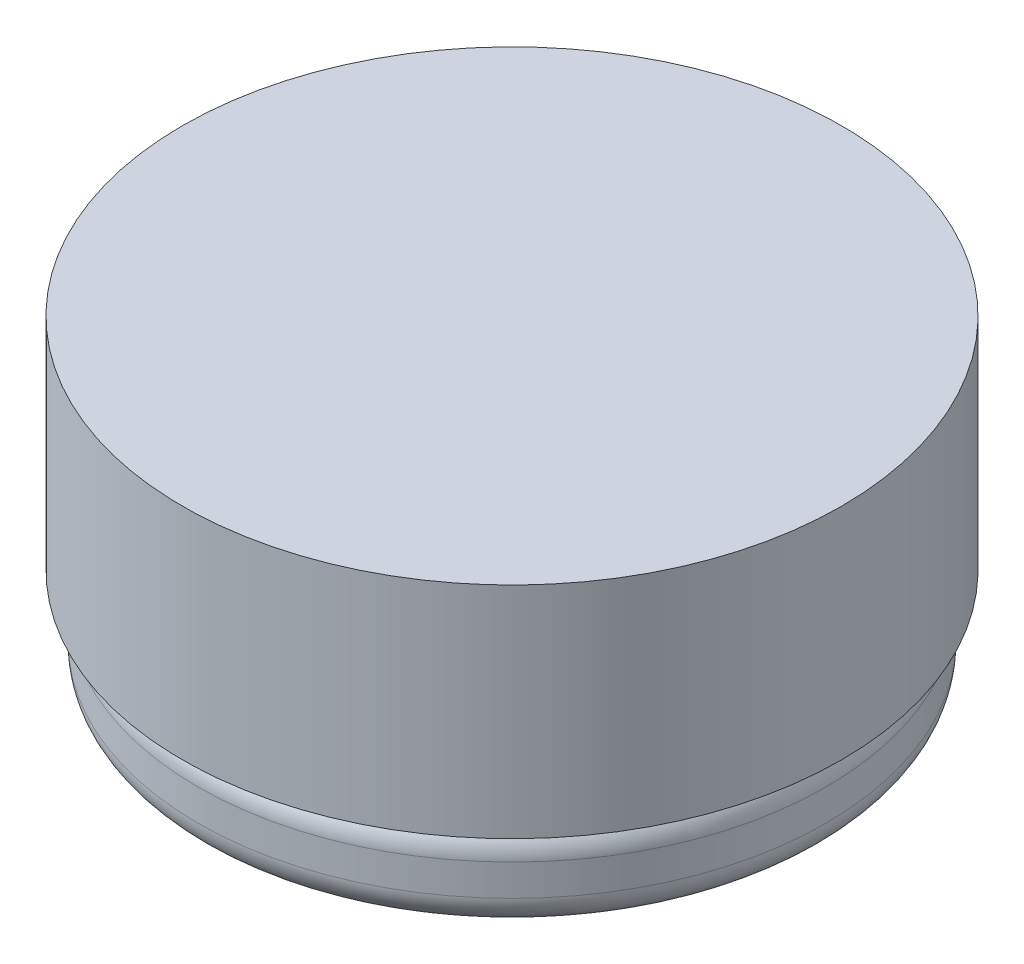
ISO-10303-21;
HEADER;
FILE_DESCRIPTION(('STEP AP214'),'2;1');
FILE_NAME('part.step','',(''),(''),'','','');
FILE_SCHEMA(('AUTOMOTIVE_DESIGN { 1 0 10303 214 1 1 1 1 }'));
ENDSEC;
DATA;
#1=APPLICATION_CONTEXT('core data for automotive mechanical design processes');
#2=APPLICATION_PROTOCOL_DEFINITION('international standard','automotive_design',2000,#1);
#3=PRODUCT_CONTEXT('',#1,'mechanical');
#4=PRODUCT('Part','Part','',(#3));
#5=PRODUCT_RELATED_PRODUCT_CATEGORY('part','',(#4));
#6=PRODUCT_DEFINITION_FORMATION('','',#4);
#7=PRODUCT_DEFINITION_CONTEXT('part definition',#1,'design');
#8=PRODUCT_DEFINITION('design','',#6,#7);
#9=PRODUCT_DEFINITION_SHAPE('','',#8);
#10=(LENGTH_UNIT() NAMED_UNIT(*) SI_UNIT(.MILLI.,.METRE.));
#11=(NAMED_UNIT(*) PLANE_ANGLE_UNIT() SI_UNIT($,.RADIAN.));
#12=(NAMED_UNIT(*) SI_UNIT($,.STERADIAN.) SOLID_ANGLE_UNIT());
#13=UNCERTAINTY_MEASURE_WITH_UNIT(LENGTH_MEASURE(1.E-05),#10,'distance_accuracy_value','');
#14=(GEOMETRIC_REPRESENTATION_CONTEXT(3) GLOBAL_UNCERTAINTY_ASSIGNED_CONTEXT((#13)) GLOBAL_UNIT_ASSIGNED_CONTEXT((#10,
#11,#12)) REPRESENTATION_CONTEXT('',''));
#15=CARTESIAN_POINT('',(0.,0.,0.));
#16=DIRECTION('',(0.,0.,1.));
#17=DIRECTION('',(1.,0.,0.));
#18=AXIS2_PLACEMENT_3D('',#15,#16,#17);
#19=CARTESIAN_POINT('',(-2.,-5.,0.4));
#20=DIRECTION('',(0.,0.,1.));
#21=DIRECTION('',(1.,0.,0.));
#22=AXIS2_PLACEMENT_3D('',#19,#20,#21);
#23=PLANE('',#22);
#24=DIRECTION('',(0.,-1.,0.));
#25=VECTOR('',#24,1.);
#26=CARTESIAN_POINT('',(0.4,-5.,0.4));
#27=LINE('',#26,#25);
#28=CARTESIAN_POINT('',(0.4,-3.6,0.4));
#29=VERTEX_POINT('',#28);
#30=CARTESIAN_POINT('',(0.4,-5.,0.4));
#31=VERTEX_POINT('',#30);
#32=EDGE_CURVE('P0_E40',#29,#31,#27,.T.);
#33=ORIENTED_EDGE('',*,*,#32,.F.);
#34=DIRECTION('',(1.,0.,0.));
#35=VECTOR('',#34,1.);
#36=CARTESIAN_POINT('',(-2.,-3.6,0.4));
#37=LINE('',#36,#35);
#38=CARTESIAN_POINT('',(0.6,-3.6,0.4));
#39=VERTEX_POINT('',#38);
#40=EDGE_CURVE('P0_E11',#29,#39,#37,.T.);
#41=ORIENTED_EDGE('',*,*,#40,.T.);
#42=DIRECTION('',(0.707106781186547,-0.707106781186548,0.));
#43=VECTOR('',#42,1.);
#44=CARTESIAN_POINT('',(0.65,-3.65,0.4));
#45=LINE('',#44,#43);
#46=CARTESIAN_POINT('',(2.,-5.,0.4));
#47=VERTEX_POINT('',#46);
#48=EDGE_CURVE('P0_E27',#39,#47,#45,.T.);
#49=ORIENTED_EDGE('',*,*,#48,.T.);
#50=DIRECTION('',(1.,0.,0.));
#51=VECTOR('',#50,1.);
#52=CARTESIAN_POINT('',(-1.,-5.,0.4));
#53=LINE('',#52,#51);
#54=EDGE_CURVE('P0_E217',#31,#47,#53,.T.);
#55=ORIENTED_EDGE('',*,*,#54,.F.);
#56=EDGE_LOOP('',(#33,#41,#49,#55));
#57=FACE_BOUND('',#56,.T.);
#58=ADVANCED_FACE('P0_F16',(#57),#23,.F.);
#59=CARTESIAN_POINT('',(2.,-5.,-0.4));
#60=DIRECTION('',(0.,0.,-1.));
#61=DIRECTION('',(0.,-1.,0.));
#62=AXIS2_PLACEMENT_3D('',#59,#60,#61);
#63=PLANE('',#62);
#64=DIRECTION('',(0.,1.,0.));
#65=VECTOR('',#64,1.);
#66=CARTESIAN_POINT('',(0.4,-5.,-0.4));
#67=LINE('',#66,#65);
#68=CARTESIAN_POINT('',(0.4,-5.,-0.4));
#69=VERTEX_POINT('',#68);
#70=CARTESIAN_POINT('',(0.4,-3.6,-0.4));
#71=VERTEX_POINT('',#70);
#72=EDGE_CURVE('P0_E225',#69,#71,#67,.T.);
#73=ORIENTED_EDGE('',*,*,#72,.F.);
#74=DIRECTION('',(-1.,0.,0.));
#75=VECTOR('',#74,1.);
#76=CARTESIAN_POINT('',(1.,-5.,-0.4));
#77=LINE('',#76,#75);
#78=CARTESIAN_POINT('',(2.,-5.,-0.4));
#79=VERTEX_POINT('',#78);
#80=EDGE_CURVE('P0_E231',#79,#69,#77,.T.);
#81=ORIENTED_EDGE('',*,*,#80,.F.);
#82=DIRECTION('',(-0.707106781186547,0.707106781186548,0.));
#83=VECTOR('',#82,1.);
#84=CARTESIAN_POINT('',(1.65,-4.65,-0.4));
#85=LINE('',#84,#83);
#86=CARTESIAN_POINT('',(0.6,-3.6,-0.4));
#87=VERTEX_POINT('',#86);
#88=EDGE_CURVE('P0_E275',#79,#87,#85,.T.);
#89=ORIENTED_EDGE('',*,*,#88,.T.);
#90=DIRECTION('',(-1.,0.,0.));
#91=VECTOR('',#90,1.);
#92=CARTESIAN_POINT('',(2.,-3.6,-0.4));
#93=LINE('',#92,#91);
#94=EDGE_CURVE('P0_E187',#87,#71,#93,.T.);
#95=ORIENTED_EDGE('',*,*,#94,.T.);
#96=EDGE_LOOP('',(#73,#81,#89,#95));
#97=FACE_BOUND('',#96,.T.);
#98=ADVANCED_FACE('P0_F18',(#97),#63,.F.);
#99=CARTESIAN_POINT('',(-1.3,-4.3,-0.2));
#100=DIRECTION('',(-0.707106781186548,0.707106781186547,0.));
#101=DIRECTION('',(0.,0.,1.));
#102=AXIS2_PLACEMENT_3D('',#99,#100,#101);
#103=PLANE('',#102);
#104=DIRECTION('',(0.707106781186547,0.707106781186548,0.));
#105=VECTOR('',#104,1.);
#106=CARTESIAN_POINT('',(-1.65,-4.65,0.4));
#107=LINE('',#106,#105);
#108=CARTESIAN_POINT('',(-2.,-5.,0.4));
#109=VERTEX_POINT('',#108);
#110=CARTESIAN_POINT('',(-0.6,-3.6,0.4));
#111=VERTEX_POINT('',#110);
#112=EDGE_CURVE('P0_E206',#109,#111,#107,.T.);
#113=ORIENTED_EDGE('',*,*,#112,.F.);
#114=DIRECTION('',(0.,0.,1.));
#115=VECTOR('',#114,1.);
#116=CARTESIAN_POINT('',(-2.,-5.,-0.1));
#117=LINE('',#116,#115);
#118=CARTESIAN_POINT('',(-2.,-5.,-0.4));
#119=VERTEX_POINT('',#118);
#120=EDGE_CURVE('P0_E144',#119,#109,#117,.T.);
#121=ORIENTED_EDGE('',*,*,#120,.F.);
#122=DIRECTION('',(-0.707106781186547,-0.707106781186548,0.));
#123=VECTOR('',#122,1.);
#124=CARTESIAN_POINT('',(-0.65,-3.65,-0.4));
#125=LINE('',#124,#123);
#126=CARTESIAN_POINT('',(-0.6,-3.6,-0.4));
#127=VERTEX_POINT('',#126);
#128=EDGE_CURVE('P0_E210',#127,#119,#125,.T.);
#129=ORIENTED_EDGE('',*,*,#128,.F.);
#130=DIRECTION('',(0.,0.,-1.));
#131=VECTOR('',#130,1.);
#132=CARTESIAN_POINT('',(-0.6,-3.6,-0.2));
#133=LINE('',#132,#131);
#134=EDGE_CURVE('P0_E297',#111,#127,#133,.T.);
#135=ORIENTED_EDGE('',*,*,#134,.F.);
#136=EDGE_LOOP('',(#113,#121,#129,#135));
#137=FACE_BOUND('',#136,.T.);
#138=ADVANCED_FACE('P0_F317',(#137),#103,.F.);
#139=CARTESIAN_POINT('',(2.,-5.,-0.4));
#140=DIRECTION('',(0.,0.,-1.));
#141=DIRECTION('',(0.,-1.,0.));
#142=AXIS2_PLACEMENT_3D('',#139,#140,#141);
#143=PLANE('',#142);
#144=DIRECTION('',(0.,-1.,0.));
#145=VECTOR('',#144,1.);
#146=CARTESIAN_POINT('',(-0.4,-5.,-0.4));
#147=LINE('',#146,#145);
#148=CARTESIAN_POINT('',(-0.4,-3.6,-0.4));
#149=VERTEX_POINT('',#148);
#150=CARTESIAN_POINT('',(-0.4,-5.,-0.4));
#151=VERTEX_POINT('',#150);
#152=EDGE_CURVE('P0_E20',#149,#151,#147,.T.);
#153=ORIENTED_EDGE('',*,*,#152,.F.);
#154=DIRECTION('',(-1.,0.,0.));
#155=VECTOR('',#154,1.);
#156=CARTESIAN_POINT('',(2.,-3.6,-0.4));
#157=LINE('',#156,#155);
#158=EDGE_CURVE('P0_E269',#149,#127,#157,.T.);
#159=ORIENTED_EDGE('',*,*,#158,.T.);
#160=ORIENTED_EDGE('',*,*,#128,.T.);
#161=DIRECTION('',(-1.,0.,0.));
#162=VECTOR('',#161,1.);
#163=CARTESIAN_POINT('',(1.,-5.,-0.4));
#164=LINE('',#163,#162);
#165=EDGE_CURVE('P0_E71',#151,#119,#164,.T.);
#166=ORIENTED_EDGE('',*,*,#165,.F.);
#167=EDGE_LOOP('',(#153,#159,#160,#166));
#168=FACE_BOUND('',#167,.T.);
#169=ADVANCED_FACE('P0_F318',(#168),#143,.F.);
#170=CARTESIAN_POINT('',(1.3,-4.3,0.2));
#171=DIRECTION('',(0.707106781186548,0.707106781186547,0.));
#172=DIRECTION('',(0.,0.,-1.));
#173=AXIS2_PLACEMENT_3D('',#170,#171,#172);
#174=PLANE('',#173);
#175=ORIENTED_EDGE('',*,*,#88,.F.);
#176=DIRECTION('',(0.,0.,-1.));
#177=VECTOR('',#176,1.);
#178=CARTESIAN_POINT('',(2.,-5.,0.1));
#179=LINE('',#178,#177);
#180=EDGE_CURVE('P0_E263',#47,#79,#179,.T.);
#181=ORIENTED_EDGE('',*,*,#180,.F.);
#182=ORIENTED_EDGE('',*,*,#48,.F.);
#183=DIRECTION('',(0.,0.,1.));
#184=VECTOR('',#183,1.);
#185=CARTESIAN_POINT('',(0.6,-3.6,0.2));
#186=LINE('',#185,#184);
#187=EDGE_CURVE('P0_E244',#87,#39,#186,.T.);
#188=ORIENTED_EDGE('',*,*,#187,.F.);
#189=EDGE_LOOP('',(#175,#181,#182,#188));
#190=FACE_BOUND('',#189,.T.);
#191=ADVANCED_FACE('P0_F320',(#190),#174,.F.);
#192=CARTESIAN_POINT('',(-2.,-5.,0.4));
#193=DIRECTION('',(0.,0.,1.));
#194=DIRECTION('',(1.,0.,0.));
#195=AXIS2_PLACEMENT_3D('',#192,#193,#194);
#196=PLANE('',#195);
#197=DIRECTION('',(0.,1.,0.));
#198=VECTOR('',#197,1.);
#199=CARTESIAN_POINT('',(-0.4,-5.,0.4));
#200=LINE('',#199,#198);
#201=CARTESIAN_POINT('',(-0.4,-5.,0.4));
#202=VERTEX_POINT('',#201);
#203=CARTESIAN_POINT('',(-0.4,-3.6,0.4));
#204=VERTEX_POINT('',#203);
#205=EDGE_CURVE('P0_E83',#202,#204,#200,.T.);
#206=ORIENTED_EDGE('',*,*,#205,.F.);
#207=DIRECTION('',(1.,0.,0.));
#208=VECTOR('',#207,1.);
#209=CARTESIAN_POINT('',(-1.,-5.,0.4));
#210=LINE('',#209,#208);
#211=EDGE_CURVE('P0_E301',#109,#202,#210,.T.);
#212=ORIENTED_EDGE('',*,*,#211,.F.);
#213=ORIENTED_EDGE('',*,*,#112,.T.);
#214=DIRECTION('',(1.,0.,0.));
#215=VECTOR('',#214,1.);
#216=CARTESIAN_POINT('',(-2.,-3.6,0.4));
#217=LINE('',#216,#215);
#218=EDGE_CURVE('P0_E211',#111,#204,#217,.T.);
#219=ORIENTED_EDGE('',*,*,#218,.T.);
#220=EDGE_LOOP('',(#206,#212,#213,#219));
#221=FACE_BOUND('',#220,.T.);
#222=ADVANCED_FACE('P0_F327',(#221),#196,.F.);
#223=CARTESIAN_POINT('',(0.4,-5.,2.));
#224=DIRECTION('',(1.,0.,0.));
#225=DIRECTION('',(0.,0.,1.));
#226=AXIS2_PLACEMENT_3D('',#223,#224,#225);
#227=PLANE('',#226);
#228=ORIENTED_EDGE('',*,*,#72,.T.);
#229=DIRECTION('',(0.,0.,-1.));
#230=VECTOR('',#229,1.);
#231=CARTESIAN_POINT('',(0.4,-3.6,2.));
#232=LINE('',#231,#230);
#233=CARTESIAN_POINT('',(0.4,-3.6,-0.6));
#234=VERTEX_POINT('',#233);
#235=EDGE_CURVE('P0_E205',#71,#234,#232,.T.);
#236=ORIENTED_EDGE('',*,*,#235,.T.);
#237=DIRECTION('',(0.,-0.707106781186548,-0.707106781186547));
#238=VECTOR('',#237,1.);
#239=CARTESIAN_POINT('',(0.4,-3.65,-0.65));
#240=LINE('',#239,#238);
#241=CARTESIAN_POINT('',(0.4,-5.,-2.));
#242=VERTEX_POINT('',#241);
#243=EDGE_CURVE('P0_E190',#234,#242,#240,.T.);
#244=ORIENTED_EDGE('',*,*,#243,.T.);
#245=DIRECTION('',(0.,0.,-1.));
#246=VECTOR('',#245,1.);
#247=CARTESIAN_POINT('',(0.4,-5.,1.));
#248=LINE('',#247,#246);
#249=EDGE_CURVE('P0_E228',#69,#242,#248,.T.);
#250=ORIENTED_EDGE('',*,*,#249,.F.);
#251=EDGE_LOOP('',(#228,#236,#244,#250));
#252=FACE_BOUND('',#251,.T.);
#253=ADVANCED_FACE('P0_F355',(#252),#227,.F.);
#254=CARTESIAN_POINT('',(0.4,-5.,2.));
#255=DIRECTION('',(1.,0.,0.));
#256=DIRECTION('',(0.,0.,1.));
#257=AXIS2_PLACEMENT_3D('',#254,#255,#256);
#258=PLANE('',#257);
#259=ORIENTED_EDGE('',*,*,#32,.T.);
#260=DIRECTION('',(0.,0.,-1.));
#261=VECTOR('',#260,1.);
#262=CARTESIAN_POINT('',(0.4,-5.,1.));
#263=LINE('',#262,#261);
#264=CARTESIAN_POINT('',(0.4,-5.,2.));
#265=VERTEX_POINT('',#264);
#266=EDGE_CURVE('P0_E196',#265,#31,#263,.T.);
#267=ORIENTED_EDGE('',*,*,#266,.F.);
#268=DIRECTION('',(0.,0.707106781186548,-0.707106781186547));
#269=VECTOR('',#268,1.);
#270=CARTESIAN_POINT('',(0.4,-4.65,1.65));
#271=LINE('',#270,#269);
#272=CARTESIAN_POINT('',(0.4,-3.6,0.6));
#273=VERTEX_POINT('',#272);
#274=EDGE_CURVE('P0_E191',#265,#273,#271,.T.);
#275=ORIENTED_EDGE('',*,*,#274,.T.);
#276=DIRECTION('',(0.,0.,-1.));
#277=VECTOR('',#276,1.);
#278=CARTESIAN_POINT('',(0.4,-3.6,2.));
#279=LINE('',#278,#277);
#280=EDGE_CURVE('P0_E192',#273,#29,#279,.T.);
#281=ORIENTED_EDGE('',*,*,#280,.T.);
#282=EDGE_LOOP('',(#259,#267,#275,#281));
#283=FACE_BOUND('',#282,.T.);
#284=ADVANCED_FACE('P0_F359',(#283),#258,.F.);
#285=CARTESIAN_POINT('',(-0.4,-5.,-2.));
#286=DIRECTION('',(-1.,0.,0.));
#287=DIRECTION('',(0.,0.,1.));
#288=AXIS2_PLACEMENT_3D('',#285,#286,#287);
#289=PLANE('',#288);
#290=ORIENTED_EDGE('',*,*,#152,.T.);
#291=DIRECTION('',(0.,0.,1.));
#292=VECTOR('',#291,1.);
#293=CARTESIAN_POINT('',(-0.4,-5.,-1.));
#294=LINE('',#293,#292);
#295=CARTESIAN_POINT('',(-0.4,-5.,-2.));
#296=VERTEX_POINT('',#295);
#297=EDGE_CURVE('P0_E260',#296,#151,#294,.T.);
#298=ORIENTED_EDGE('',*,*,#297,.F.);
#299=DIRECTION('',(0.,0.707106781186548,0.707106781186547));
#300=VECTOR('',#299,1.);
#301=CARTESIAN_POINT('',(-0.4,-4.65,-1.65));
#302=LINE('',#301,#300);
#303=CARTESIAN_POINT('',(-0.4,-3.6,-0.6));
#304=VERTEX_POINT('',#303);
#305=EDGE_CURVE('P0_E216',#296,#304,#302,.T.);
#306=ORIENTED_EDGE('',*,*,#305,.T.);
#307=DIRECTION('',(0.,0.,1.));
#308=VECTOR('',#307,1.);
#309=CARTESIAN_POINT('',(-0.4,-3.6,-2.));
#310=LINE('',#309,#308);
#311=EDGE_CURVE('P0_E212',#304,#149,#310,.T.);
#312=ORIENTED_EDGE('',*,*,#311,.T.);
#313=EDGE_LOOP('',(#290,#298,#306,#312));
#314=FACE_BOUND('',#313,.T.);
#315=ADVANCED_FACE('P0_F356',(#314),#289,.F.);
#316=CARTESIAN_POINT('',(0.,-5.,0.));
#317=DIRECTION('',(0.,1.,0.));
#318=DIRECTION('',(1.,0.,0.));
#319=AXIS2_PLACEMENT_3D('',#316,#317,#318);
#320=PLANE('',#319);
#321=CARTESIAN_POINT('',(0.,-5.,0.));
#322=DIRECTION('',(0.,1.,0.));
#323=DIRECTION('',(-1.,0.,0.));
#324=AXIS2_PLACEMENT_3D('',#321,#322,#323);
#325=CIRCLE('',#324,4.5);
#326=CARTESIAN_POINT('',(4.5,-5.,0.));
#327=VERTEX_POINT('',#326);
#328=EDGE_CURVE('P0_E172',#327,#327,#325,.T.);
#329=ORIENTED_EDGE('',*,*,#328,.F.);
#330=EDGE_LOOP('',(#329));
#331=FACE_BOUND('',#330,.T.);
#332=ORIENTED_EDGE('',*,*,#54,.T.);
#333=ORIENTED_EDGE('',*,*,#180,.T.);
#334=ORIENTED_EDGE('',*,*,#80,.T.);
#335=ORIENTED_EDGE('',*,*,#249,.T.);
#336=DIRECTION('',(-1.,0.,0.));
#337=VECTOR('',#336,1.);
#338=CARTESIAN_POINT('',(0.2,-5.,-2.));
#339=LINE('',#338,#337);
#340=EDGE_CURVE('P0_E232',#242,#296,#339,.T.);
#341=ORIENTED_EDGE('',*,*,#340,.T.);
#342=ORIENTED_EDGE('',*,*,#297,.T.);
#343=ORIENTED_EDGE('',*,*,#165,.T.);
#344=ORIENTED_EDGE('',*,*,#120,.T.);
#345=ORIENTED_EDGE('',*,*,#211,.T.);
#346=DIRECTION('',(0.,0.,1.));
#347=VECTOR('',#346,1.);
#348=CARTESIAN_POINT('',(-0.4,-5.,-1.));
#349=LINE('',#348,#347);
#350=CARTESIAN_POINT('',(-0.4,-5.,2.));
#351=VERTEX_POINT('',#350);
#352=EDGE_CURVE('P0_E221',#202,#351,#349,.T.);
#353=ORIENTED_EDGE('',*,*,#352,.T.);
#354=DIRECTION('',(1.,0.,0.));
#355=VECTOR('',#354,1.);
#356=CARTESIAN_POINT('',(-0.2,-5.,2.));
#357=LINE('',#356,#355);
#358=EDGE_CURVE('P0_E200',#351,#265,#357,.T.);
#359=ORIENTED_EDGE('',*,*,#358,.T.);
#360=ORIENTED_EDGE('',*,*,#266,.T.);
#361=EDGE_LOOP('',(#332,#333,#334,#335,#341,#342,#343,#344,#345,#353,#359,#360));
#362=FACE_BOUND('',#361,.T.);
#363=ADVANCED_FACE('P0_F351',(#331,#362),#320,.F.);
#364=CARTESIAN_POINT('',(-0.2,-4.3,1.3));
#365=DIRECTION('',(0.,-0.707106781186547,-0.707106781186548));
#366=DIRECTION('',(0.,-0.707106781186548,0.707106781186547));
#367=AXIS2_PLACEMENT_3D('',#364,#365,#366);
#368=PLANE('',#367);
#369=ORIENTED_EDGE('',*,*,#274,.F.);
#370=ORIENTED_EDGE('',*,*,#358,.F.);
#371=DIRECTION('',(0.,-0.707106781186548,0.707106781186547));
#372=VECTOR('',#371,1.);
#373=CARTESIAN_POINT('',(-0.4,-3.65,0.65));
#374=LINE('',#373,#372);
#375=CARTESIAN_POINT('',(-0.4,-3.6,0.6));
#376=VERTEX_POINT('',#375);
#377=EDGE_CURVE('P0_E171',#376,#351,#374,.T.);
#378=ORIENTED_EDGE('',*,*,#377,.F.);
#379=DIRECTION('',(1.,0.,0.));
#380=VECTOR('',#379,1.);
#381=CARTESIAN_POINT('',(-0.2,-3.6,0.6));
#382=LINE('',#381,#380);
#383=EDGE_CURVE('P0_E201',#376,#273,#382,.T.);
#384=ORIENTED_EDGE('',*,*,#383,.T.);
#385=EDGE_LOOP('',(#369,#370,#378,#384));
#386=FACE_BOUND('',#385,.T.);
#387=ADVANCED_FACE('P0_F348',(#386),#368,.T.);
#388=CARTESIAN_POINT('',(0.,-3.6,0.));
#389=DIRECTION('',(0.,1.,0.));
#390=DIRECTION('',(1.,0.,0.));
#391=AXIS2_PLACEMENT_3D('',#388,#389,#390);
#392=PLANE('',#391);
#393=ORIENTED_EDGE('',*,*,#383,.F.);
#394=DIRECTION('',(0.,0.,1.));
#395=VECTOR('',#394,1.);
#396=CARTESIAN_POINT('',(-0.4,-3.6,-2.));
#397=LINE('',#396,#395);
#398=EDGE_CURVE('P0_E179',#204,#376,#397,.T.);
#399=ORIENTED_EDGE('',*,*,#398,.F.);
#400=ORIENTED_EDGE('',*,*,#218,.F.);
#401=ORIENTED_EDGE('',*,*,#134,.T.);
#402=ORIENTED_EDGE('',*,*,#158,.F.);
#403=ORIENTED_EDGE('',*,*,#311,.F.);
#404=DIRECTION('',(-1.,0.,0.));
#405=VECTOR('',#404,1.);
#406=CARTESIAN_POINT('',(0.2,-3.6,-0.6));
#407=LINE('',#406,#405);
#408=EDGE_CURVE('P0_E236',#234,#304,#407,.T.);
#409=ORIENTED_EDGE('',*,*,#408,.F.);
#410=ORIENTED_EDGE('',*,*,#235,.F.);
#411=ORIENTED_EDGE('',*,*,#94,.F.);
#412=ORIENTED_EDGE('',*,*,#187,.T.);
#413=ORIENTED_EDGE('',*,*,#40,.F.);
#414=ORIENTED_EDGE('',*,*,#280,.F.);
#415=EDGE_LOOP('',(#393,#399,#400,#401,#402,#403,#409,#410,#411,#412,#413,#414));
#416=FACE_BOUND('',#415,.T.);
#417=ADVANCED_FACE('P0_F316',(#416),#392,.F.);
#418=CARTESIAN_POINT('',(0.2,-4.3,-1.3));
#419=DIRECTION('',(0.,-0.707106781186547,0.707106781186548));
#420=DIRECTION('',(-1.,0.,0.));
#421=AXIS2_PLACEMENT_3D('',#418,#419,#420);
#422=PLANE('',#421);
#423=ORIENTED_EDGE('',*,*,#305,.F.);
#424=ORIENTED_EDGE('',*,*,#340,.F.);
#425=ORIENTED_EDGE('',*,*,#243,.F.);
#426=ORIENTED_EDGE('',*,*,#408,.T.);
#427=EDGE_LOOP('',(#423,#424,#425,#426));
#428=FACE_BOUND('',#427,.T.);
#429=ADVANCED_FACE('P0_F366',(#428),#422,.T.);
#430=CARTESIAN_POINT('',(-0.4,-5.,-2.));
#431=DIRECTION('',(-1.,0.,0.));
#432=DIRECTION('',(0.,0.,1.));
#433=AXIS2_PLACEMENT_3D('',#430,#431,#432);
#434=PLANE('',#433);
#435=ORIENTED_EDGE('',*,*,#205,.T.);
#436=ORIENTED_EDGE('',*,*,#398,.T.);
#437=ORIENTED_EDGE('',*,*,#377,.T.);
#438=ORIENTED_EDGE('',*,*,#352,.F.);
#439=EDGE_LOOP('',(#435,#436,#437,#438));
#440=FACE_BOUND('',#439,.T.);
#441=ADVANCED_FACE('P0_F374',(#440),#434,.F.);
#442=CARTESIAN_POINT('',(0.,-4.5,0.));
#443=DIRECTION('',(0.,-1.,0.));
#444=DIRECTION('',(0.,0.,-1.));
#445=AXIS2_PLACEMENT_3D('',#442,#443,#444);
#446=TOROIDAL_SURFACE('',#445,4.5,0.5);
#447=CARTESIAN_POINT('',(0.,-4.5,0.));
#448=DIRECTION('',(0.,-1.,0.));
#449=DIRECTION('',(-1.,0.,0.));
#450=AXIS2_PLACEMENT_3D('',#447,#448,#449);
#451=CIRCLE('',#450,5.);
#452=CARTESIAN_POINT('',(5.,-4.5,0.));
#453=VERTEX_POINT('',#452);
#454=EDGE_CURVE('P0_E167',#453,#453,#451,.T.);
#455=ORIENTED_EDGE('',*,*,#454,.T.);
#456=EDGE_LOOP('',(#455));
#457=FACE_BOUND('',#456,.T.);
#458=ORIENTED_EDGE('',*,*,#328,.T.);
#459=EDGE_LOOP('',(#458));
#460=FACE_BOUND('',#459,.T.);
#461=ADVANCED_FACE('P0_F345',(#457,#460),#446,.T.);
#462=CARTESIAN_POINT('',(0.,-3.5,0.));
#463=DIRECTION('',(0.,-1.,0.));
#464=DIRECTION('',(-1.,0.,0.));
#465=AXIS2_PLACEMENT_3D('',#462,#463,#464);
#466=CYLINDRICAL_SURFACE('',#465,5.);
#467=CARTESIAN_POINT('',(0.,-4.,0.));
#468=DIRECTION('',(0.,1.,0.));
#469=DIRECTION('',(-1.,0.,0.));
#470=AXIS2_PLACEMENT_3D('',#467,#468,#469);
#471=CIRCLE('',#470,5.);
#472=CARTESIAN_POINT('',(5.,-4.,0.));
#473=VERTEX_POINT('',#472);
#474=EDGE_CURVE('P0_E183',#473,#473,#471,.T.);
#475=ORIENTED_EDGE('',*,*,#474,.F.);
#476=EDGE_LOOP('',(#475));
#477=FACE_BOUND('',#476,.T.);
#478=ORIENTED_EDGE('',*,*,#454,.F.);
#479=EDGE_LOOP('',(#478));
#480=FACE_BOUND('',#479,.T.);
#481=ADVANCED_FACE('P0_F168',(#477,#480),#466,.T.);
#482=CARTESIAN_POINT('',(0.,-4.,0.));
#483=DIRECTION('',(0.,1.,0.));
#484=DIRECTION('',(0.,0.,1.));
#485=AXIS2_PLACEMENT_3D('',#482,#483,#484);
#486=TOROIDAL_SURFACE('',#485,4.5,0.5);
#487=ORIENTED_EDGE('',*,*,#474,.T.);
#488=EDGE_LOOP('',(#487));
#489=FACE_BOUND('',#488,.T.);
#490=CARTESIAN_POINT('',(0.,-3.5,0.));
#491=DIRECTION('',(0.,-1.,0.));
#492=DIRECTION('',(-1.,0.,0.));
#493=AXIS2_PLACEMENT_3D('',#490,#491,#492);
#494=CIRCLE('',#493,4.5);
#495=CARTESIAN_POINT('',(4.5,-3.5,0.));
#496=VERTEX_POINT('',#495);
#497=EDGE_CURVE('P0_E257',#496,#496,#494,.T.);
#498=ORIENTED_EDGE('',*,*,#497,.T.);
#499=EDGE_LOOP('',(#498));
#500=FACE_BOUND('',#499,.T.);
#501=ADVANCED_FACE('P0_F342',(#489,#500),#486,.T.);
#502=CARTESIAN_POINT('',(0.,-3.5,0.));
#503=DIRECTION('',(0.,1.,0.));
#504=DIRECTION('',(1.,0.,0.));
#505=AXIS2_PLACEMENT_3D('',#502,#503,#504);
#506=PLANE('',#505);
#507=ORIENTED_EDGE('',*,*,#497,.F.);
#508=EDGE_LOOP('',(#507));
#509=FACE_BOUND('',#508,.T.);
#510=ADVANCED_FACE('P0_F339',(#509),#506,.T.);
#511=CLOSED_SHELL('',(#58,#98,#138,#169,#191,#222,#253,#284,#315,#363,#387,#417,#429,#441,#461,
#481,#501,#510));
#512=MANIFOLD_SOLID_BREP('P0_B1',#511);
#513=CARTESIAN_POINT('',(0.,0.,0.));
#514=DIRECTION('',(0.,-1.,0.));
#515=DIRECTION('',(1.,0.,0.));
#516=AXIS2_PLACEMENT_3D('',#513,#514,#515);
#517=CYLINDRICAL_SURFACE('',#516,5.25);
#518=CARTESIAN_POINT('',(0.,-3.5,0.));
#519=DIRECTION('',(0.,-1.,0.));
#520=DIRECTION('',(1.,0.,0.));
#521=AXIS2_PLACEMENT_3D('',#518,#519,#520);
#522=CIRCLE('',#521,5.25);
#523=CARTESIAN_POINT('',(-5.25,-3.5,0.));
#524=VERTEX_POINT('',#523);
#525=EDGE_CURVE('P1_E25',#524,#524,#522,.T.);
#526=ORIENTED_EDGE('',*,*,#525,.F.);
#527=EDGE_LOOP('',(#526));
#528=FACE_BOUND('',#527,.T.);
#529=CARTESIAN_POINT('',(0.,0.,0.));
#530=DIRECTION('',(0.,-1.,0.));
#531=DIRECTION('',(1.,0.,0.));
#532=AXIS2_PLACEMENT_3D('',#529,#530,#531);
#533=CIRCLE('',#532,5.25);
#534=CARTESIAN_POINT('',(-5.25,0.,0.));
#535=VERTEX_POINT('',#534);
#536=EDGE_CURVE('P1_E11',#535,#535,#533,.T.);
#537=ORIENTED_EDGE('',*,*,#536,.T.);
#538=EDGE_LOOP('',(#537));
#539=FACE_BOUND('',#538,.T.);
#540=ADVANCED_FACE('P1_F16',(#528,#539),#517,.T.);
#541=CARTESIAN_POINT('',(0.,-3.5,0.));
#542=DIRECTION('',(0.,1.,0.));
#543=DIRECTION('',(1.,0.,0.));
#544=AXIS2_PLACEMENT_3D('',#541,#542,#543);
#545=PLANE('',#544);
#546=ORIENTED_EDGE('',*,*,#525,.T.);
#547=EDGE_LOOP('',(#546));
#548=FACE_BOUND('',#547,.T.);
#549=ADVANCED_FACE('P1_F41',(#548),#545,.F.);
#550=CARTESIAN_POINT('',(0.,0.,0.));
#551=DIRECTION('',(0.,1.,0.));
#552=DIRECTION('',(1.,0.,0.));
#553=AXIS2_PLACEMENT_3D('',#550,#551,#552);
#554=PLANE('',#553);
#555=ORIENTED_EDGE('',*,*,#536,.F.);
#556=EDGE_LOOP('',(#555));
#557=FACE_BOUND('',#556,.T.);
#558=ADVANCED_FACE('P1_F38',(#557),#554,.T.);
#559=CLOSED_SHELL('',(#540,#549,#558));
#560=MANIFOLD_SOLID_BREP('P1_B1',#559);
#561=ADVANCED_BREP_SHAPE_REPRESENTATION('',(#18,#512,#560),#14);
#562=SHAPE_DEFINITION_REPRESENTATION(#9,#561);
ENDSEC;
END-ISO-10303-21;
